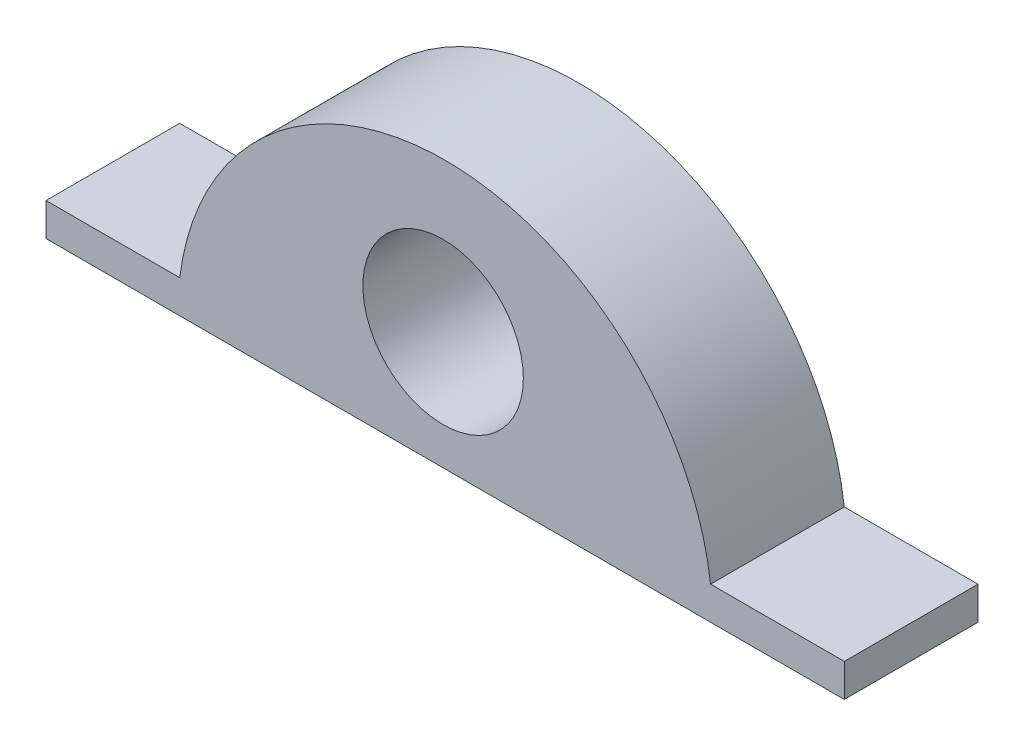
ISO-10303-21;
HEADER;
FILE_DESCRIPTION(('STEP AP214'),'2;1');
FILE_NAME('part.step','',(''),(''),'','','');
FILE_SCHEMA(('AUTOMOTIVE_DESIGN { 1 0 10303 214 1 1 1 1 }'));
ENDSEC;
DATA;
#1=APPLICATION_CONTEXT('core data for automotive mechanical design processes');
#2=APPLICATION_PROTOCOL_DEFINITION('international standard','automotive_design',2000,#1);
#3=PRODUCT_CONTEXT('',#1,'mechanical');
#4=PRODUCT('Part','Part','',(#3));
#5=PRODUCT_RELATED_PRODUCT_CATEGORY('part','',(#4));
#6=PRODUCT_DEFINITION_FORMATION('','',#4);
#7=PRODUCT_DEFINITION_CONTEXT('part definition',#1,'design');
#8=PRODUCT_DEFINITION('design','',#6,#7);
#9=PRODUCT_DEFINITION_SHAPE('','',#8);
#10=(LENGTH_UNIT() NAMED_UNIT(*) SI_UNIT(.MILLI.,.METRE.));
#11=(NAMED_UNIT(*) PLANE_ANGLE_UNIT() SI_UNIT($,.RADIAN.));
#12=(NAMED_UNIT(*) SI_UNIT($,.STERADIAN.) SOLID_ANGLE_UNIT());
#13=UNCERTAINTY_MEASURE_WITH_UNIT(LENGTH_MEASURE(1.E-05),#10,'distance_accuracy_value','');
#14=(GEOMETRIC_REPRESENTATION_CONTEXT(3) GLOBAL_UNCERTAINTY_ASSIGNED_CONTEXT((#13)) GLOBAL_UNIT_ASSIGNED_CONTEXT((#10,
#11,#12)) REPRESENTATION_CONTEXT('',''));
#15=CARTESIAN_POINT('',(0.,0.,0.));
#16=DIRECTION('',(0.,0.,1.));
#17=DIRECTION('',(1.,0.,0.));
#18=AXIS2_PLACEMENT_3D('',#15,#16,#17);
#19=CARTESIAN_POINT('',(0.00214742413010005,-44.2946058091286,25.));
#20=DIRECTION('',(0.,0.,-1.));
#21=DIRECTION('',(-1.,0.,0.));
#22=AXIS2_PLACEMENT_3D('',#19,#20,#21);
#23=PLANE('',#22);
#24=CARTESIAN_POINT('',(0.00214742413010005,-44.2946058091286,25.));
#25=DIRECTION('',(0.,0.,1.));
#26=DIRECTION('',(-1.,0.,0.));
#27=AXIS2_PLACEMENT_3D('',#24,#25,#26);
#28=CIRCLE('',#27,50.);
#29=CARTESIAN_POINT('',(49.6206109983601,-38.1295370720572,25.));
#30=VERTEX_POINT('',#29);
#31=CARTESIAN_POINT('',(-49.6163161500998,-38.1295370720572,25.));
#32=VERTEX_POINT('',#31);
#33=EDGE_CURVE('E129',#30,#32,#28,.T.);
#34=ORIENTED_EDGE('',*,*,#33,.T.);
#35=DIRECTION('',(-1.,0.,0.));
#36=VECTOR('',#35,1.);
#37=CARTESIAN_POINT('',(-49.6163161500998,-38.1295370720572,25.));
#38=LINE('',#37,#36);
#39=CARTESIAN_POINT('',(-74.6163161500998,-38.1295370720572,25.));
#40=VERTEX_POINT('',#39);
#41=EDGE_CURVE('E87',#32,#40,#38,.T.);
#42=ORIENTED_EDGE('',*,*,#41,.T.);
#43=DIRECTION('',(0.,-1.,0.));
#44=VECTOR('',#43,1.);
#45=CARTESIAN_POINT('',(-74.6163161500998,-38.1295370720572,25.));
#46=LINE('',#45,#44);
#47=CARTESIAN_POINT('',(-74.6163161500998,-44.2946058091283,25.));
#48=VERTEX_POINT('',#47);
#49=EDGE_CURVE('E100',#40,#48,#46,.T.);
#50=ORIENTED_EDGE('',*,*,#49,.T.);
#51=DIRECTION('',(1.,0.,0.));
#52=VECTOR('',#51,1.);
#53=CARTESIAN_POINT('',(-49.6163161500998,-44.2946058091283,25.));
#54=LINE('',#53,#52);
#55=CARTESIAN_POINT('',(74.62061099836,-44.2946058091286,25.));
#56=VERTEX_POINT('',#55);
#57=EDGE_CURVE('E94',#48,#56,#54,.T.);
#58=ORIENTED_EDGE('',*,*,#57,.T.);
#59=DIRECTION('',(0.,1.,0.));
#60=VECTOR('',#59,1.);
#61=CARTESIAN_POINT('',(74.62061099836,-38.1295370720572,25.));
#62=LINE('',#61,#60);
#63=CARTESIAN_POINT('',(74.62061099836,-38.1295370720572,25.));
#64=VERTEX_POINT('',#63);
#65=EDGE_CURVE('E98',#56,#64,#62,.T.);
#66=ORIENTED_EDGE('',*,*,#65,.T.);
#67=DIRECTION('',(-1.,0.,0.));
#68=VECTOR('',#67,1.);
#69=CARTESIAN_POINT('',(49.6206109983601,-38.1295370720572,25.));
#70=LINE('',#69,#68);
#71=EDGE_CURVE('E50',#64,#30,#70,.T.);
#72=ORIENTED_EDGE('',*,*,#71,.T.);
#73=EDGE_LOOP('',(#34,#42,#50,#58,#66,#72));
#74=FACE_BOUND('',#73,.T.);
#75=CARTESIAN_POINT('',(-0.379389001639932,-22.2946058091283,25.));
#76=DIRECTION('',(0.,0.,1.));
#77=DIRECTION('',(1.,0.,0.));
#78=AXIS2_PLACEMENT_3D('',#75,#76,#77);
#79=CIRCLE('',#78,15.);
#80=CARTESIAN_POINT('',(14.6206109983601,-22.2946058091283,25.));
#81=VERTEX_POINT('',#80);
#82=EDGE_CURVE('E121',#81,#81,#79,.T.);
#83=ORIENTED_EDGE('',*,*,#82,.F.);
#84=EDGE_LOOP('',(#83));
#85=FACE_BOUND('',#84,.T.);
#86=ADVANCED_FACE('F33',(#74,#85),#23,.F.);
#87=CARTESIAN_POINT('',(0.00214742413010005,-44.2946058091286,0.));
#88=DIRECTION('',(0.,0.,-1.));
#89=DIRECTION('',(-1.,0.,0.));
#90=AXIS2_PLACEMENT_3D('',#87,#88,#89);
#91=PLANE('',#90);
#92=CARTESIAN_POINT('',(0.00214742413010005,-44.2946058091286,0.));
#93=DIRECTION('',(0.,0.,1.));
#94=DIRECTION('',(-1.,0.,0.));
#95=AXIS2_PLACEMENT_3D('',#92,#93,#94);
#96=CIRCLE('',#95,50.);
#97=CARTESIAN_POINT('',(49.6206109983601,-38.1295370720572,0.));
#98=VERTEX_POINT('',#97);
#99=CARTESIAN_POINT('',(-49.6163161500998,-38.1295370720572,0.));
#100=VERTEX_POINT('',#99);
#101=EDGE_CURVE('E117',#98,#100,#96,.T.);
#102=ORIENTED_EDGE('',*,*,#101,.F.);
#103=DIRECTION('',(-1.,0.,0.));
#104=VECTOR('',#103,1.);
#105=CARTESIAN_POINT('',(49.6206109983601,-38.1295370720572,0.));
#106=LINE('',#105,#104);
#107=CARTESIAN_POINT('',(74.62061099836,-38.1295370720572,0.));
#108=VERTEX_POINT('',#107);
#109=EDGE_CURVE('E79',#108,#98,#106,.T.);
#110=ORIENTED_EDGE('',*,*,#109,.F.);
#111=DIRECTION('',(0.,1.,0.));
#112=VECTOR('',#111,1.);
#113=CARTESIAN_POINT('',(74.62061099836,-38.1295370720572,0.));
#114=LINE('',#113,#112);
#115=CARTESIAN_POINT('',(74.62061099836,-44.2946058091286,0.));
#116=VERTEX_POINT('',#115);
#117=EDGE_CURVE('E73',#116,#108,#114,.T.);
#118=ORIENTED_EDGE('',*,*,#117,.F.);
#119=DIRECTION('',(1.,0.,0.));
#120=VECTOR('',#119,1.);
#121=CARTESIAN_POINT('',(49.6206109983601,-44.2946058091286,0.));
#122=LINE('',#121,#120);
#123=CARTESIAN_POINT('',(-74.6163161500998,-44.2946058091283,0.));
#124=VERTEX_POINT('',#123);
#125=EDGE_CURVE('E107',#124,#116,#122,.T.);
#126=ORIENTED_EDGE('',*,*,#125,.F.);
#127=DIRECTION('',(0.,-1.,0.));
#128=VECTOR('',#127,1.);
#129=CARTESIAN_POINT('',(-74.6163161500998,-38.1295370720572,0.));
#130=LINE('',#129,#128);
#131=CARTESIAN_POINT('',(-74.6163161500998,-38.1295370720572,0.));
#132=VERTEX_POINT('',#131);
#133=EDGE_CURVE('E123',#132,#124,#130,.T.);
#134=ORIENTED_EDGE('',*,*,#133,.F.);
#135=DIRECTION('',(-1.,0.,0.));
#136=VECTOR('',#135,1.);
#137=CARTESIAN_POINT('',(-49.6163161500998,-38.1295370720572,0.));
#138=LINE('',#137,#136);
#139=EDGE_CURVE('E120',#100,#132,#138,.T.);
#140=ORIENTED_EDGE('',*,*,#139,.F.);
#141=EDGE_LOOP('',(#102,#110,#118,#126,#134,#140));
#142=FACE_BOUND('',#141,.T.);
#143=CARTESIAN_POINT('',(-0.379389001639932,-22.2946058091283,0.));
#144=DIRECTION('',(0.,0.,1.));
#145=DIRECTION('',(1.,0.,0.));
#146=AXIS2_PLACEMENT_3D('',#143,#144,#145);
#147=CIRCLE('',#146,15.);
#148=CARTESIAN_POINT('',(14.6206109983601,-22.2946058091283,0.));
#149=VERTEX_POINT('',#148);
#150=EDGE_CURVE('E228',#149,#149,#147,.T.);
#151=ORIENTED_EDGE('',*,*,#150,.T.);
#152=EDGE_LOOP('',(#151));
#153=FACE_BOUND('',#152,.T.);
#154=ADVANCED_FACE('F138',(#142,#153),#91,.T.);
#155=CARTESIAN_POINT('',(0.00214742413010005,-44.2946058091286,25.));
#156=DIRECTION('',(0.,0.,-1.));
#157=DIRECTION('',(-1.,0.,0.));
#158=AXIS2_PLACEMENT_3D('',#155,#156,#157);
#159=CYLINDRICAL_SURFACE('',#158,50.);
#160=ORIENTED_EDGE('',*,*,#101,.T.);
#161=DIRECTION('',(0.,0.,-1.));
#162=VECTOR('',#161,1.);
#163=CARTESIAN_POINT('',(-49.6163161500998,-38.1295370720572,25.));
#164=LINE('',#163,#162);
#165=EDGE_CURVE('E11',#32,#100,#164,.T.);
#166=ORIENTED_EDGE('',*,*,#165,.F.);
#167=ORIENTED_EDGE('',*,*,#33,.F.);
#168=DIRECTION('',(0.,0.,-1.));
#169=VECTOR('',#168,1.);
#170=CARTESIAN_POINT('',(49.6206109983601,-38.1295370720572,25.));
#171=LINE('',#170,#169);
#172=EDGE_CURVE('E113',#30,#98,#171,.T.);
#173=ORIENTED_EDGE('',*,*,#172,.T.);
#174=EDGE_LOOP('',(#160,#166,#167,#173));
#175=FACE_BOUND('',#174,.T.);
#176=ADVANCED_FACE('F35',(#175),#159,.T.);
#177=CARTESIAN_POINT('',(-49.6163161500998,-38.1295370720572,25.));
#178=DIRECTION('',(0.,-1.,0.));
#179=DIRECTION('',(0.,0.,-1.));
#180=AXIS2_PLACEMENT_3D('',#177,#178,#179);
#181=PLANE('',#180);
#182=ORIENTED_EDGE('',*,*,#139,.T.);
#183=DIRECTION('',(0.,0.,-1.));
#184=VECTOR('',#183,1.);
#185=CARTESIAN_POINT('',(-74.6163161500998,-38.1295370720572,25.));
#186=LINE('',#185,#184);
#187=EDGE_CURVE('E42',#40,#132,#186,.T.);
#188=ORIENTED_EDGE('',*,*,#187,.F.);
#189=ORIENTED_EDGE('',*,*,#41,.F.);
#190=ORIENTED_EDGE('',*,*,#165,.T.);
#191=EDGE_LOOP('',(#182,#188,#189,#190));
#192=FACE_BOUND('',#191,.T.);
#193=ADVANCED_FACE('F163',(#192),#181,.F.);
#194=CARTESIAN_POINT('',(-74.6163161500998,-38.1295370720572,25.));
#195=DIRECTION('',(1.,0.,0.));
#196=DIRECTION('',(0.,0.,-1.));
#197=AXIS2_PLACEMENT_3D('',#194,#195,#196);
#198=PLANE('',#197);
#199=ORIENTED_EDGE('',*,*,#133,.T.);
#200=DIRECTION('',(0.,0.,-1.));
#201=VECTOR('',#200,1.);
#202=CARTESIAN_POINT('',(-74.6163161500998,-44.2946058091283,25.));
#203=LINE('',#202,#201);
#204=EDGE_CURVE('E108',#48,#124,#203,.T.);
#205=ORIENTED_EDGE('',*,*,#204,.F.);
#206=ORIENTED_EDGE('',*,*,#49,.F.);
#207=ORIENTED_EDGE('',*,*,#187,.T.);
#208=EDGE_LOOP('',(#199,#205,#206,#207));
#209=FACE_BOUND('',#208,.T.);
#210=ADVANCED_FACE('F135',(#209),#198,.F.);
#211=CARTESIAN_POINT('',(49.6206109983601,-44.2946058091286,25.));
#212=DIRECTION('',(0.,1.,0.));
#213=DIRECTION('',(0.,0.,1.));
#214=AXIS2_PLACEMENT_3D('',#211,#212,#213);
#215=PLANE('',#214);
#216=ORIENTED_EDGE('',*,*,#125,.T.);
#217=DIRECTION('',(0.,0.,-1.));
#218=VECTOR('',#217,1.);
#219=CARTESIAN_POINT('',(74.62061099836,-44.2946058091286,25.));
#220=LINE('',#219,#218);
#221=EDGE_CURVE('E105',#56,#116,#220,.T.);
#222=ORIENTED_EDGE('',*,*,#221,.F.);
#223=ORIENTED_EDGE('',*,*,#57,.F.);
#224=ORIENTED_EDGE('',*,*,#204,.T.);
#225=EDGE_LOOP('',(#216,#222,#223,#224));
#226=FACE_BOUND('',#225,.T.);
#227=ADVANCED_FACE('F106',(#226),#215,.F.);
#228=CARTESIAN_POINT('',(74.62061099836,-38.1295370720572,25.));
#229=DIRECTION('',(-1.,0.,0.));
#230=DIRECTION('',(0.,0.,1.));
#231=AXIS2_PLACEMENT_3D('',#228,#229,#230);
#232=PLANE('',#231);
#233=ORIENTED_EDGE('',*,*,#117,.T.);
#234=DIRECTION('',(0.,0.,-1.));
#235=VECTOR('',#234,1.);
#236=CARTESIAN_POINT('',(74.62061099836,-38.1295370720572,25.));
#237=LINE('',#236,#235);
#238=EDGE_CURVE('E109',#64,#108,#237,.T.);
#239=ORIENTED_EDGE('',*,*,#238,.F.);
#240=ORIENTED_EDGE('',*,*,#65,.F.);
#241=ORIENTED_EDGE('',*,*,#221,.T.);
#242=EDGE_LOOP('',(#233,#239,#240,#241));
#243=FACE_BOUND('',#242,.T.);
#244=ADVANCED_FACE('F111',(#243),#232,.F.);
#245=CARTESIAN_POINT('',(49.6206109983601,-38.1295370720572,25.));
#246=DIRECTION('',(0.,-1.,0.));
#247=DIRECTION('',(0.,0.,-1.));
#248=AXIS2_PLACEMENT_3D('',#245,#246,#247);
#249=PLANE('',#248);
#250=ORIENTED_EDGE('',*,*,#109,.T.);
#251=ORIENTED_EDGE('',*,*,#172,.F.);
#252=ORIENTED_EDGE('',*,*,#71,.F.);
#253=ORIENTED_EDGE('',*,*,#238,.T.);
#254=EDGE_LOOP('',(#250,#251,#252,#253));
#255=FACE_BOUND('',#254,.T.);
#256=ADVANCED_FACE('F143',(#255),#249,.F.);
#257=CARTESIAN_POINT('',(-0.379389001639932,-22.2946058091283,25.));
#258=DIRECTION('',(0.,0.,-1.));
#259=DIRECTION('',(-1.,0.,0.));
#260=AXIS2_PLACEMENT_3D('',#257,#258,#259);
#261=CYLINDRICAL_SURFACE('',#260,15.);
#262=ORIENTED_EDGE('',*,*,#82,.T.);
#263=EDGE_LOOP('',(#262));
#264=FACE_BOUND('',#263,.T.);
#265=ORIENTED_EDGE('',*,*,#150,.F.);
#266=EDGE_LOOP('',(#265));
#267=FACE_BOUND('',#266,.T.);
#268=ADVANCED_FACE('F145',(#264,#267),#261,.F.);
#269=CLOSED_SHELL('',(#86,#154,#176,#193,#210,#227,#244,#256,#268));
#270=MANIFOLD_SOLID_BREP('B2',#269);
#271=ADVANCED_BREP_SHAPE_REPRESENTATION('',(#18,#270),#14);
#272=SHAPE_DEFINITION_REPRESENTATION(#9,#271);
ENDSEC;
END-ISO-10303-21;
